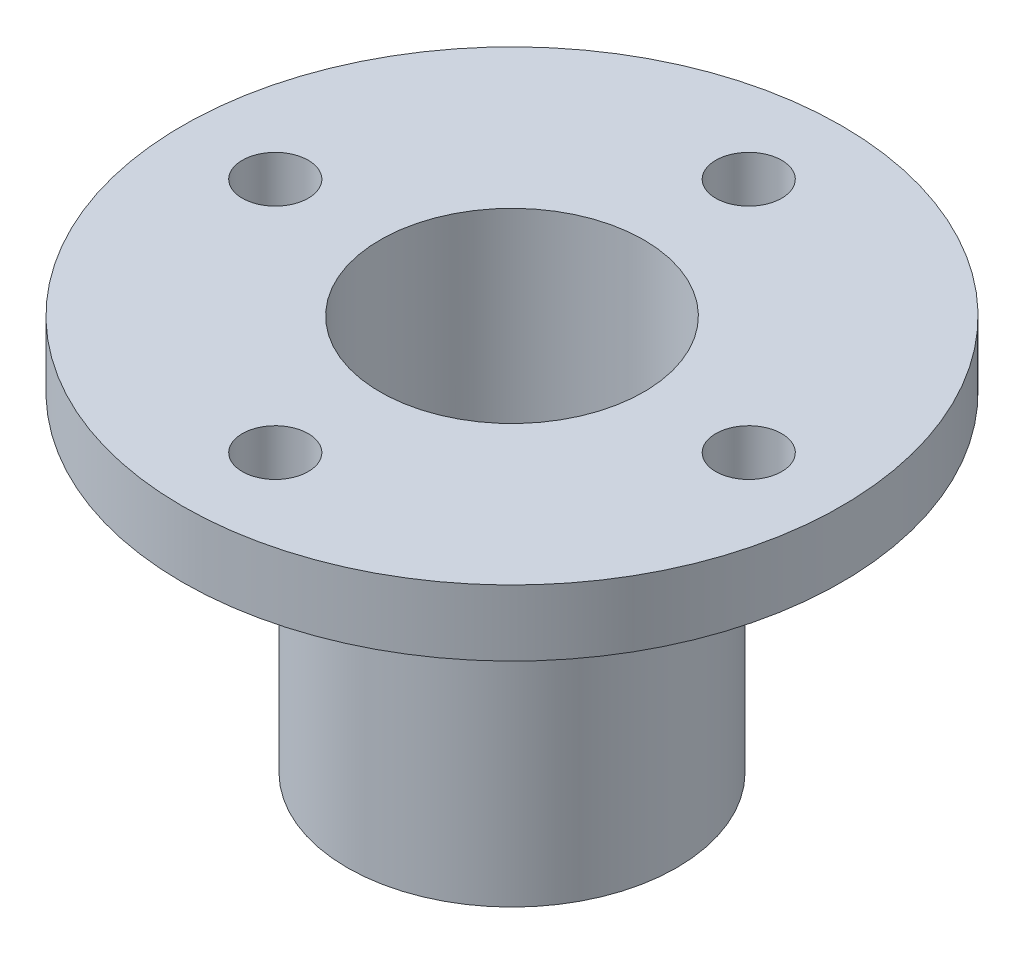
ISO-10303-21;
HEADER;
FILE_DESCRIPTION(('STEP AP214'),'2;1');
FILE_NAME('part.step','',(''),(''),'','','');
FILE_SCHEMA(('AUTOMOTIVE_DESIGN { 1 0 10303 214 1 1 1 1 }'));
ENDSEC;
DATA;
#1=APPLICATION_CONTEXT('core data for automotive mechanical design processes');
#2=APPLICATION_PROTOCOL_DEFINITION('international standard','automotive_design',2000,#1);
#3=PRODUCT_CONTEXT('',#1,'mechanical');
#4=PRODUCT('Part','Part','',(#3));
#5=PRODUCT_RELATED_PRODUCT_CATEGORY('part','',(#4));
#6=PRODUCT_DEFINITION_FORMATION('','',#4);
#7=PRODUCT_DEFINITION_CONTEXT('part definition',#1,'design');
#8=PRODUCT_DEFINITION('design','',#6,#7);
#9=PRODUCT_DEFINITION_SHAPE('','',#8);
#10=(LENGTH_UNIT() NAMED_UNIT(*) SI_UNIT(.MILLI.,.METRE.));
#11=(NAMED_UNIT(*) PLANE_ANGLE_UNIT() SI_UNIT($,.RADIAN.));
#12=(NAMED_UNIT(*) SI_UNIT($,.STERADIAN.) SOLID_ANGLE_UNIT());
#13=UNCERTAINTY_MEASURE_WITH_UNIT(LENGTH_MEASURE(1.E-05),#10,'distance_accuracy_value','');
#14=(GEOMETRIC_REPRESENTATION_CONTEXT(3) GLOBAL_UNCERTAINTY_ASSIGNED_CONTEXT((#13)) GLOBAL_UNIT_ASSIGNED_CONTEXT((#10,
#11,#12)) REPRESENTATION_CONTEXT('',''));
#15=CARTESIAN_POINT('',(0.,0.,0.));
#16=DIRECTION('',(0.,0.,1.));
#17=DIRECTION('',(1.,0.,0.));
#18=AXIS2_PLACEMENT_3D('',#15,#16,#17);
#19=CARTESIAN_POINT('',(0.,0.,0.));
#20=DIRECTION('',(0.,1.,0.));
#21=DIRECTION('',(0.,0.,1.));
#22=AXIS2_PLACEMENT_3D('',#19,#20,#21);
#23=PLANE('',#22);
#24=CARTESIAN_POINT('',(0.,0.,0.));
#25=DIRECTION('',(0.,1.,0.));
#26=DIRECTION('',(0.,0.,1.));
#27=AXIS2_PLACEMENT_3D('',#24,#25,#26);
#28=CIRCLE('',#27,5.);
#29=CARTESIAN_POINT('',(0.,0.,5.));
#30=VERTEX_POINT('',#29);
#31=EDGE_CURVE('E35',#30,#30,#28,.T.);
#32=ORIENTED_EDGE('',*,*,#31,.F.);
#33=EDGE_LOOP('',(#32));
#34=FACE_BOUND('',#33,.T.);
#35=CARTESIAN_POINT('',(0.,0.,0.));
#36=DIRECTION('',(0.,1.,0.));
#37=DIRECTION('',(0.,0.,1.));
#38=AXIS2_PLACEMENT_3D('',#35,#36,#37);
#39=CIRCLE('',#38,4.);
#40=CARTESIAN_POINT('',(0.,0.,4.));
#41=VERTEX_POINT('',#40);
#42=EDGE_CURVE('E42',#41,#41,#39,.T.);
#43=ORIENTED_EDGE('',*,*,#42,.T.);
#44=EDGE_LOOP('',(#43));
#45=FACE_BOUND('',#44,.T.);
#46=ADVANCED_FACE('F31',(#34,#45),#23,.F.);
#47=CARTESIAN_POINT('',(0.,10.,0.));
#48=DIRECTION('',(0.,-1.,0.));
#49=DIRECTION('',(0.,0.,-1.));
#50=AXIS2_PLACEMENT_3D('',#47,#48,#49);
#51=CYLINDRICAL_SURFACE('',#50,5.);
#52=CARTESIAN_POINT('',(0.,10.,0.));
#53=DIRECTION('',(0.,1.,0.));
#54=DIRECTION('',(0.,0.,1.));
#55=AXIS2_PLACEMENT_3D('',#52,#53,#54);
#56=CIRCLE('',#55,5.);
#57=CARTESIAN_POINT('',(0.,10.,5.));
#58=VERTEX_POINT('',#57);
#59=EDGE_CURVE('E10',#58,#58,#56,.T.);
#60=ORIENTED_EDGE('',*,*,#59,.F.);
#61=EDGE_LOOP('',(#60));
#62=FACE_BOUND('',#61,.T.);
#63=ORIENTED_EDGE('',*,*,#31,.T.);
#64=EDGE_LOOP('',(#63));
#65=FACE_BOUND('',#64,.T.);
#66=ADVANCED_FACE('F33',(#62,#65),#51,.T.);
#67=CARTESIAN_POINT('',(0.,10.,0.));
#68=DIRECTION('',(0.,-1.,0.));
#69=DIRECTION('',(0.,0.,-1.));
#70=AXIS2_PLACEMENT_3D('',#67,#68,#69);
#71=CYLINDRICAL_SURFACE('',#70,4.);
#72=ORIENTED_EDGE('',*,*,#42,.F.);
#73=EDGE_LOOP('',(#72));
#74=FACE_BOUND('',#73,.T.);
#75=CARTESIAN_POINT('',(0.,12.,0.));
#76=DIRECTION('',(0.,-1.,0.));
#77=DIRECTION('',(0.,0.,-1.));
#78=AXIS2_PLACEMENT_3D('',#75,#76,#77);
#79=CIRCLE('',#78,4.);
#80=CARTESIAN_POINT('',(0.,12.,-4.));
#81=VERTEX_POINT('',#80);
#82=EDGE_CURVE('E57',#81,#81,#79,.T.);
#83=ORIENTED_EDGE('',*,*,#82,.F.);
#84=EDGE_LOOP('',(#83));
#85=FACE_BOUND('',#84,.T.);
#86=ADVANCED_FACE('F83',(#74,#85),#71,.F.);
#87=CARTESIAN_POINT('',(0.,12.,0.));
#88=DIRECTION('',(0.,-1.,0.));
#89=DIRECTION('',(0.,0.,-1.));
#90=AXIS2_PLACEMENT_3D('',#87,#88,#89);
#91=CYLINDRICAL_SURFACE('',#90,10.);
#92=CARTESIAN_POINT('',(0.,12.,0.));
#93=DIRECTION('',(0.,1.,0.));
#94=DIRECTION('',(0.,0.,1.));
#95=AXIS2_PLACEMENT_3D('',#92,#93,#94);
#96=CIRCLE('',#95,10.);
#97=CARTESIAN_POINT('',(0.,12.,10.));
#98=VERTEX_POINT('',#97);
#99=EDGE_CURVE('E46',#98,#98,#96,.T.);
#100=ORIENTED_EDGE('',*,*,#99,.F.);
#101=EDGE_LOOP('',(#100));
#102=FACE_BOUND('',#101,.T.);
#103=CARTESIAN_POINT('',(0.,10.,0.));
#104=DIRECTION('',(0.,1.,0.));
#105=DIRECTION('',(0.,0.,1.));
#106=AXIS2_PLACEMENT_3D('',#103,#104,#105);
#107=CIRCLE('',#106,10.);
#108=CARTESIAN_POINT('',(0.,10.,10.));
#109=VERTEX_POINT('',#108);
#110=EDGE_CURVE('E47',#109,#109,#107,.T.);
#111=ORIENTED_EDGE('',*,*,#110,.T.);
#112=EDGE_LOOP('',(#111));
#113=FACE_BOUND('',#112,.T.);
#114=ADVANCED_FACE('F85',(#102,#113),#91,.T.);
#115=CARTESIAN_POINT('',(0.,12.,0.));
#116=DIRECTION('',(0.,1.,0.));
#117=DIRECTION('',(0.,0.,1.));
#118=AXIS2_PLACEMENT_3D('',#115,#116,#117);
#119=PLANE('',#118);
#120=ORIENTED_EDGE('',*,*,#82,.T.);
#121=EDGE_LOOP('',(#120));
#122=FACE_BOUND('',#121,.T.);
#123=CARTESIAN_POINT('',(7.18325260874764,12.,0.));
#124=DIRECTION('',(0.,-1.,0.));
#125=DIRECTION('',(0.,0.,-1.));
#126=AXIS2_PLACEMENT_3D('',#123,#124,#125);
#127=CIRCLE('',#126,1.);
#128=CARTESIAN_POINT('',(7.18325260874764,12.,-1.));
#129=VERTEX_POINT('',#128);
#130=EDGE_CURVE('E50',#129,#129,#127,.T.);
#131=ORIENTED_EDGE('',*,*,#130,.T.);
#132=EDGE_LOOP('',(#131));
#133=FACE_BOUND('',#132,.T.);
#134=CARTESIAN_POINT('',(0.,12.,-7.18325260874764));
#135=DIRECTION('',(0.,-1.,0.));
#136=DIRECTION('',(0.,0.,-1.));
#137=AXIS2_PLACEMENT_3D('',#134,#135,#136);
#138=CIRCLE('',#137,1.);
#139=CARTESIAN_POINT('',(0.,12.,-8.18325260874764));
#140=VERTEX_POINT('',#139);
#141=EDGE_CURVE('E69',#140,#140,#138,.T.);
#142=ORIENTED_EDGE('',*,*,#141,.T.);
#143=EDGE_LOOP('',(#142));
#144=FACE_BOUND('',#143,.T.);
#145=CARTESIAN_POINT('',(-7.18325260874764,12.,0.));
#146=DIRECTION('',(0.,-1.,0.));
#147=DIRECTION('',(0.,0.,-1.));
#148=AXIS2_PLACEMENT_3D('',#145,#146,#147);
#149=CIRCLE('',#148,0.999999999999999);
#150=CARTESIAN_POINT('',(-7.18325260874764,12.,-0.999999999999949));
#151=VERTEX_POINT('',#150);
#152=EDGE_CURVE('E63',#151,#151,#149,.T.);
#153=ORIENTED_EDGE('',*,*,#152,.T.);
#154=EDGE_LOOP('',(#153));
#155=FACE_BOUND('',#154,.T.);
#156=CARTESIAN_POINT('',(0.,12.,7.18325260874764));
#157=DIRECTION('',(0.,-1.,0.));
#158=DIRECTION('',(0.,0.,-1.));
#159=AXIS2_PLACEMENT_3D('',#156,#157,#158);
#160=CIRCLE('',#159,1.);
#161=CARTESIAN_POINT('',(0.,12.,6.18325260874764));
#162=VERTEX_POINT('',#161);
#163=EDGE_CURVE('E56',#162,#162,#160,.T.);
#164=ORIENTED_EDGE('',*,*,#163,.T.);
#165=EDGE_LOOP('',(#164));
#166=FACE_BOUND('',#165,.T.);
#167=ORIENTED_EDGE('',*,*,#99,.T.);
#168=EDGE_LOOP('',(#167));
#169=FACE_BOUND('',#168,.T.);
#170=ADVANCED_FACE('F80',(#122,#133,#144,#155,#166,#169),#119,.T.);
#171=CARTESIAN_POINT('',(0.,10.,0.));
#172=DIRECTION('',(0.,1.,0.));
#173=DIRECTION('',(0.,0.,1.));
#174=AXIS2_PLACEMENT_3D('',#171,#172,#173);
#175=PLANE('',#174);
#176=CARTESIAN_POINT('',(7.18325260874764,10.,0.));
#177=DIRECTION('',(0.,-1.,0.));
#178=DIRECTION('',(0.,0.,-1.));
#179=AXIS2_PLACEMENT_3D('',#176,#177,#178);
#180=CIRCLE('',#179,1.);
#181=CARTESIAN_POINT('',(7.18325260874764,10.,-1.));
#182=VERTEX_POINT('',#181);
#183=EDGE_CURVE('E72',#182,#182,#180,.T.);
#184=ORIENTED_EDGE('',*,*,#183,.F.);
#185=EDGE_LOOP('',(#184));
#186=FACE_BOUND('',#185,.T.);
#187=CARTESIAN_POINT('',(0.,10.,-7.18325260874764));
#188=DIRECTION('',(0.,-1.,0.));
#189=DIRECTION('',(0.,0.,-1.));
#190=AXIS2_PLACEMENT_3D('',#187,#188,#189);
#191=CIRCLE('',#190,1.);
#192=CARTESIAN_POINT('',(0.,10.,-8.18325260874764));
#193=VERTEX_POINT('',#192);
#194=EDGE_CURVE('E66',#193,#193,#191,.T.);
#195=ORIENTED_EDGE('',*,*,#194,.F.);
#196=EDGE_LOOP('',(#195));
#197=FACE_BOUND('',#196,.T.);
#198=CARTESIAN_POINT('',(-7.18325260874764,10.,0.));
#199=DIRECTION('',(0.,-1.,0.));
#200=DIRECTION('',(0.,0.,-1.));
#201=AXIS2_PLACEMENT_3D('',#198,#199,#200);
#202=CIRCLE('',#201,0.999999999999999);
#203=CARTESIAN_POINT('',(-7.18325260874764,10.,-0.999999999999949));
#204=VERTEX_POINT('',#203);
#205=EDGE_CURVE('E60',#204,#204,#202,.T.);
#206=ORIENTED_EDGE('',*,*,#205,.F.);
#207=EDGE_LOOP('',(#206));
#208=FACE_BOUND('',#207,.T.);
#209=CARTESIAN_POINT('',(0.,10.,7.18325260874764));
#210=DIRECTION('',(0.,-1.,0.));
#211=DIRECTION('',(0.,0.,-1.));
#212=AXIS2_PLACEMENT_3D('',#209,#210,#211);
#213=CIRCLE('',#212,1.);
#214=CARTESIAN_POINT('',(0.,10.,6.18325260874764));
#215=VERTEX_POINT('',#214);
#216=EDGE_CURVE('E53',#215,#215,#213,.T.);
#217=ORIENTED_EDGE('',*,*,#216,.F.);
#218=EDGE_LOOP('',(#217));
#219=FACE_BOUND('',#218,.T.);
#220=ORIENTED_EDGE('',*,*,#59,.T.);
#221=EDGE_LOOP('',(#220));
#222=FACE_BOUND('',#221,.T.);
#223=ORIENTED_EDGE('',*,*,#110,.F.);
#224=EDGE_LOOP('',(#223));
#225=FACE_BOUND('',#224,.T.);
#226=ADVANCED_FACE('F121',(#186,#197,#208,#219,#222,#225),#175,.F.);
#227=CARTESIAN_POINT('',(0.,12.,7.18325260874764));
#228=DIRECTION('',(0.,-1.,0.));
#229=DIRECTION('',(0.,0.,-1.));
#230=AXIS2_PLACEMENT_3D('',#227,#228,#229);
#231=CYLINDRICAL_SURFACE('',#230,1.);
#232=ORIENTED_EDGE('',*,*,#163,.F.);
#233=EDGE_LOOP('',(#232));
#234=FACE_BOUND('',#233,.T.);
#235=ORIENTED_EDGE('',*,*,#216,.T.);
#236=EDGE_LOOP('',(#235));
#237=FACE_BOUND('',#236,.T.);
#238=ADVANCED_FACE('F126',(#234,#237),#231,.F.);
#239=CARTESIAN_POINT('',(-7.18325260874764,12.,0.));
#240=DIRECTION('',(0.,-1.,0.));
#241=DIRECTION('',(0.,0.,-1.));
#242=AXIS2_PLACEMENT_3D('',#239,#240,#241);
#243=CYLINDRICAL_SURFACE('',#242,0.999999999999999);
#244=ORIENTED_EDGE('',*,*,#152,.F.);
#245=EDGE_LOOP('',(#244));
#246=FACE_BOUND('',#245,.T.);
#247=ORIENTED_EDGE('',*,*,#205,.T.);
#248=EDGE_LOOP('',(#247));
#249=FACE_BOUND('',#248,.T.);
#250=ADVANCED_FACE('F136',(#246,#249),#243,.F.);
#251=CARTESIAN_POINT('',(0.,12.,-7.18325260874764));
#252=DIRECTION('',(0.,-1.,0.));
#253=DIRECTION('',(0.,0.,-1.));
#254=AXIS2_PLACEMENT_3D('',#251,#252,#253);
#255=CYLINDRICAL_SURFACE('',#254,1.);
#256=ORIENTED_EDGE('',*,*,#141,.F.);
#257=EDGE_LOOP('',(#256));
#258=FACE_BOUND('',#257,.T.);
#259=ORIENTED_EDGE('',*,*,#194,.T.);
#260=EDGE_LOOP('',(#259));
#261=FACE_BOUND('',#260,.T.);
#262=ADVANCED_FACE('F146',(#258,#261),#255,.F.);
#263=CARTESIAN_POINT('',(7.18325260874764,12.,0.));
#264=DIRECTION('',(0.,-1.,0.));
#265=DIRECTION('',(0.,0.,-1.));
#266=AXIS2_PLACEMENT_3D('',#263,#264,#265);
#267=CYLINDRICAL_SURFACE('',#266,1.);
#268=ORIENTED_EDGE('',*,*,#130,.F.);
#269=EDGE_LOOP('',(#268));
#270=FACE_BOUND('',#269,.T.);
#271=ORIENTED_EDGE('',*,*,#183,.T.);
#272=EDGE_LOOP('',(#271));
#273=FACE_BOUND('',#272,.T.);
#274=ADVANCED_FACE('F156',(#270,#273),#267,.F.);
#275=CLOSED_SHELL('',(#46,#66,#86,#114,#170,#226,#238,#250,#262,#274));
#276=MANIFOLD_SOLID_BREP('B2',#275);
#277=ADVANCED_BREP_SHAPE_REPRESENTATION('',(#18,#276),#14);
#278=SHAPE_DEFINITION_REPRESENTATION(#9,#277);
ENDSEC;
END-ISO-10303-21;
